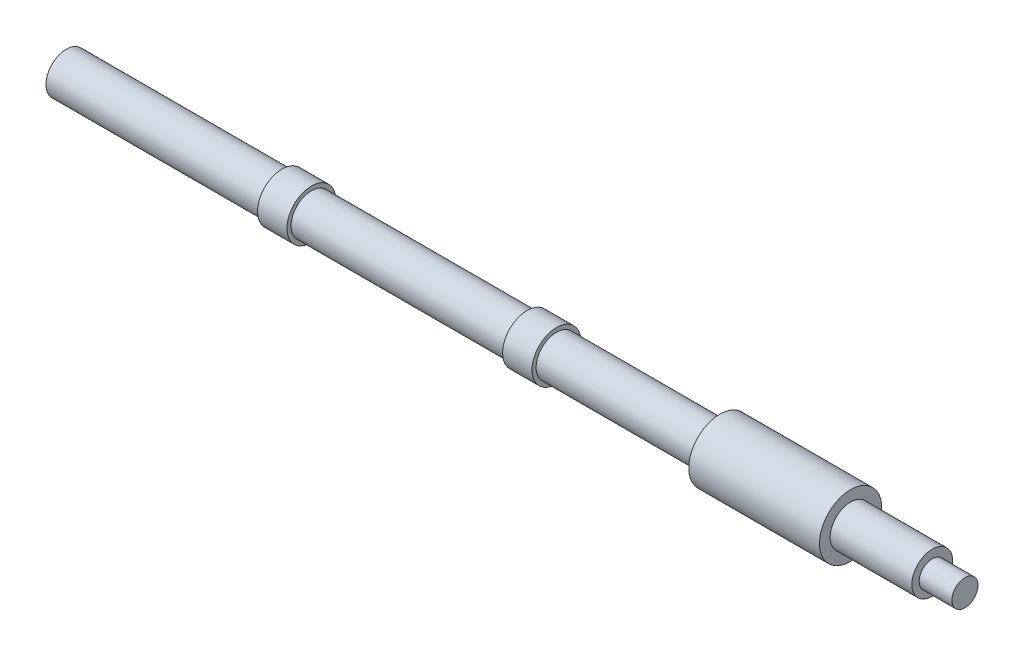
ISO-10303-21;
HEADER;
FILE_DESCRIPTION(('STEP AP214'),'2;1');
FILE_NAME('part.step','',(''),(''),'','','');
FILE_SCHEMA(('AUTOMOTIVE_DESIGN { 1 0 10303 214 1 1 1 1 }'));
ENDSEC;
DATA;
#1=APPLICATION_CONTEXT('core data for automotive mechanical design processes');
#2=APPLICATION_PROTOCOL_DEFINITION('international standard','automotive_design',2000,#1);
#3=PRODUCT_CONTEXT('',#1,'mechanical');
#4=PRODUCT('Part','Part','',(#3));
#5=PRODUCT_RELATED_PRODUCT_CATEGORY('part','',(#4));
#6=PRODUCT_DEFINITION_FORMATION('','',#4);
#7=PRODUCT_DEFINITION_CONTEXT('part definition',#1,'design');
#8=PRODUCT_DEFINITION('design','',#6,#7);
#9=PRODUCT_DEFINITION_SHAPE('','',#8);
#10=(LENGTH_UNIT() NAMED_UNIT(*) SI_UNIT(.MILLI.,.METRE.));
#11=(NAMED_UNIT(*) PLANE_ANGLE_UNIT() SI_UNIT($,.RADIAN.));
#12=(NAMED_UNIT(*) SI_UNIT($,.STERADIAN.) SOLID_ANGLE_UNIT());
#13=UNCERTAINTY_MEASURE_WITH_UNIT(LENGTH_MEASURE(1.E-05),#10,'distance_accuracy_value','');
#14=(GEOMETRIC_REPRESENTATION_CONTEXT(3) GLOBAL_UNCERTAINTY_ASSIGNED_CONTEXT((#13)) GLOBAL_UNIT_ASSIGNED_CONTEXT((#10,
#11,#12)) REPRESENTATION_CONTEXT('',''));
#15=CARTESIAN_POINT('',(0.,0.,0.));
#16=DIRECTION('',(0.,0.,1.));
#17=DIRECTION('',(1.,0.,0.));
#18=AXIS2_PLACEMENT_3D('',#15,#16,#17);
#19=CARTESIAN_POINT('',(-50.,0.,0.));
#20=DIRECTION('',(1.,0.,0.));
#21=DIRECTION('',(0.,0.,-1.));
#22=AXIS2_PLACEMENT_3D('',#19,#20,#21);
#23=CYLINDRICAL_SURFACE('',#22,12.5);
#24=CARTESIAN_POINT('',(-50.,0.,0.));
#25=DIRECTION('',(1.,0.,0.));
#26=DIRECTION('',(0.,0.,-1.));
#27=AXIS2_PLACEMENT_3D('',#24,#25,#26);
#28=CIRCLE('',#27,12.5);
#29=CARTESIAN_POINT('',(-50.,0.,-12.5));
#30=VERTEX_POINT('',#29);
#31=EDGE_CURVE('E92',#30,#30,#28,.T.);
#32=ORIENTED_EDGE('',*,*,#31,.T.);
#33=EDGE_LOOP('',(#32));
#34=FACE_BOUND('',#33,.T.);
#35=CARTESIAN_POINT('',(82.,0.,0.));
#36=DIRECTION('',(1.,0.,0.));
#37=DIRECTION('',(0.,0.,-1.));
#38=AXIS2_PLACEMENT_3D('',#35,#36,#37);
#39=CIRCLE('',#38,12.5);
#40=CARTESIAN_POINT('',(82.,0.,-12.5));
#41=VERTEX_POINT('',#40);
#42=EDGE_CURVE('E40',#41,#41,#39,.F.);
#43=ORIENTED_EDGE('',*,*,#42,.T.);
#44=EDGE_LOOP('',(#43));
#45=FACE_BOUND('',#44,.T.);
#46=ADVANCED_FACE('F37',(#34,#45),#23,.T.);
#47=CARTESIAN_POINT('',(-50.,0.,0.));
#48=DIRECTION('',(1.,0.,0.));
#49=DIRECTION('',(0.,0.,-1.));
#50=AXIS2_PLACEMENT_3D('',#47,#48,#49);
#51=PLANE('',#50);
#52=ORIENTED_EDGE('',*,*,#31,.F.);
#53=EDGE_LOOP('',(#52));
#54=FACE_BOUND('',#53,.T.);
#55=ADVANCED_FACE('F118',(#54),#51,.F.);
#56=CARTESIAN_POINT('',(82.,0.,0.));
#57=DIRECTION('',(1.,0.,0.));
#58=DIRECTION('',(0.,0.,-1.));
#59=AXIS2_PLACEMENT_3D('',#56,#57,#58);
#60=CYLINDRICAL_SURFACE('',#59,15.);
#61=CARTESIAN_POINT('',(82.,0.,0.));
#62=DIRECTION('',(1.,0.,0.));
#63=DIRECTION('',(0.,0.,-1.));
#64=AXIS2_PLACEMENT_3D('',#61,#62,#63);
#65=CIRCLE('',#64,15.);
#66=CARTESIAN_POINT('',(82.,0.,-15.));
#67=VERTEX_POINT('',#66);
#68=EDGE_CURVE('E93',#67,#67,#65,.T.);
#69=ORIENTED_EDGE('',*,*,#68,.T.);
#70=EDGE_LOOP('',(#69));
#71=FACE_BOUND('',#70,.T.);
#72=CARTESIAN_POINT('',(100.,0.,0.));
#73=DIRECTION('',(1.,0.,0.));
#74=DIRECTION('',(0.,0.,-1.));
#75=AXIS2_PLACEMENT_3D('',#72,#73,#74);
#76=CIRCLE('',#75,15.);
#77=CARTESIAN_POINT('',(100.,0.,-15.));
#78=VERTEX_POINT('',#77);
#79=EDGE_CURVE('E88',#78,#78,#76,.T.);
#80=ORIENTED_EDGE('',*,*,#79,.F.);
#81=EDGE_LOOP('',(#80));
#82=FACE_BOUND('',#81,.T.);
#83=ADVANCED_FACE('F112',(#71,#82),#60,.T.);
#84=CARTESIAN_POINT('',(82.,0.,0.));
#85=DIRECTION('',(1.,0.,0.));
#86=DIRECTION('',(0.,0.,-1.));
#87=AXIS2_PLACEMENT_3D('',#84,#85,#86);
#88=PLANE('',#87);
#89=ORIENTED_EDGE('',*,*,#42,.F.);
#90=EDGE_LOOP('',(#89));
#91=FACE_BOUND('',#90,.T.);
#92=ORIENTED_EDGE('',*,*,#68,.F.);
#93=EDGE_LOOP('',(#92));
#94=FACE_BOUND('',#93,.T.);
#95=ADVANCED_FACE('F108',(#91,#94),#88,.F.);
#96=CARTESIAN_POINT('',(100.,0.,0.));
#97=DIRECTION('',(1.,0.,0.));
#98=DIRECTION('',(0.,0.,-1.));
#99=AXIS2_PLACEMENT_3D('',#96,#97,#98);
#100=PLANE('',#99);
#101=CARTESIAN_POINT('',(100.,0.,0.));
#102=DIRECTION('',(1.,0.,0.));
#103=DIRECTION('',(0.,0.,-1.));
#104=AXIS2_PLACEMENT_3D('',#101,#102,#103);
#105=CIRCLE('',#104,12.5);
#106=CARTESIAN_POINT('',(100.,0.,-12.5));
#107=VERTEX_POINT('',#106);
#108=EDGE_CURVE('E76',#107,#107,#105,.T.);
#109=ORIENTED_EDGE('',*,*,#108,.F.);
#110=EDGE_LOOP('',(#109));
#111=FACE_BOUND('',#110,.T.);
#112=ORIENTED_EDGE('',*,*,#79,.T.);
#113=EDGE_LOOP('',(#112));
#114=FACE_BOUND('',#113,.T.);
#115=ADVANCED_FACE('F111',(#111,#114),#100,.T.);
#116=CARTESIAN_POINT('',(232.,0.,0.));
#117=DIRECTION('',(-1.,0.,0.));
#118=DIRECTION('',(0.,0.,1.));
#119=AXIS2_PLACEMENT_3D('',#116,#117,#118);
#120=CYLINDRICAL_SURFACE('',#119,12.5);
#121=CARTESIAN_POINT('',(232.,0.,0.));
#122=DIRECTION('',(1.,0.,0.));
#123=DIRECTION('',(0.,0.,-1.));
#124=AXIS2_PLACEMENT_3D('',#121,#122,#123);
#125=CIRCLE('',#124,12.5);
#126=CARTESIAN_POINT('',(232.,0.,-12.5));
#127=VERTEX_POINT('',#126);
#128=EDGE_CURVE('E81',#127,#127,#125,.T.);
#129=ORIENTED_EDGE('',*,*,#128,.F.);
#130=EDGE_LOOP('',(#129));
#131=FACE_BOUND('',#130,.T.);
#132=ORIENTED_EDGE('',*,*,#108,.T.);
#133=EDGE_LOOP('',(#132));
#134=FACE_BOUND('',#133,.T.);
#135=ADVANCED_FACE('F123',(#131,#134),#120,.T.);
#136=CARTESIAN_POINT('',(250.,0.,0.));
#137=DIRECTION('',(-1.,0.,0.));
#138=DIRECTION('',(0.,0.,1.));
#139=AXIS2_PLACEMENT_3D('',#136,#137,#138);
#140=CYLINDRICAL_SURFACE('',#139,15.);
#141=CARTESIAN_POINT('',(250.,0.,0.));
#142=DIRECTION('',(1.,0.,0.));
#143=DIRECTION('',(0.,0.,-1.));
#144=AXIS2_PLACEMENT_3D('',#141,#142,#143);
#145=CIRCLE('',#144,15.);
#146=CARTESIAN_POINT('',(250.,0.,-15.));
#147=VERTEX_POINT('',#146);
#148=EDGE_CURVE('E77',#147,#147,#145,.T.);
#149=ORIENTED_EDGE('',*,*,#148,.F.);
#150=EDGE_LOOP('',(#149));
#151=FACE_BOUND('',#150,.T.);
#152=CARTESIAN_POINT('',(232.,0.,0.));
#153=DIRECTION('',(1.,0.,0.));
#154=DIRECTION('',(0.,0.,-1.));
#155=AXIS2_PLACEMENT_3D('',#152,#153,#154);
#156=CIRCLE('',#155,15.);
#157=CARTESIAN_POINT('',(232.,0.,-15.));
#158=VERTEX_POINT('',#157);
#159=EDGE_CURVE('E72',#158,#158,#156,.T.);
#160=ORIENTED_EDGE('',*,*,#159,.T.);
#161=EDGE_LOOP('',(#160));
#162=FACE_BOUND('',#161,.T.);
#163=ADVANCED_FACE('F129',(#151,#162),#140,.T.);
#164=CARTESIAN_POINT('',(250.,0.,0.));
#165=DIRECTION('',(1.,0.,0.));
#166=DIRECTION('',(0.,0.,-1.));
#167=AXIS2_PLACEMENT_3D('',#164,#165,#166);
#168=PLANE('',#167);
#169=CARTESIAN_POINT('',(250.,0.,0.));
#170=DIRECTION('',(1.,0.,0.));
#171=DIRECTION('',(0.,0.,-1.));
#172=AXIS2_PLACEMENT_3D('',#169,#170,#171);
#173=CIRCLE('',#172,12.5);
#174=CARTESIAN_POINT('',(250.,0.,-12.5));
#175=VERTEX_POINT('',#174);
#176=EDGE_CURVE('E51',#175,#175,#173,.T.);
#177=ORIENTED_EDGE('',*,*,#176,.F.);
#178=EDGE_LOOP('',(#177));
#179=FACE_BOUND('',#178,.T.);
#180=ORIENTED_EDGE('',*,*,#148,.T.);
#181=EDGE_LOOP('',(#180));
#182=FACE_BOUND('',#181,.T.);
#183=ADVANCED_FACE('F168',(#179,#182),#168,.T.);
#184=CARTESIAN_POINT('',(232.,0.,0.));
#185=DIRECTION('',(1.,0.,0.));
#186=DIRECTION('',(0.,0.,-1.));
#187=AXIS2_PLACEMENT_3D('',#184,#185,#186);
#188=PLANE('',#187);
#189=ORIENTED_EDGE('',*,*,#128,.T.);
#190=EDGE_LOOP('',(#189));
#191=FACE_BOUND('',#190,.T.);
#192=ORIENTED_EDGE('',*,*,#159,.F.);
#193=EDGE_LOOP('',(#192));
#194=FACE_BOUND('',#193,.T.);
#195=ADVANCED_FACE('F176',(#191,#194),#188,.F.);
#196=CARTESIAN_POINT('',(350.,0.,0.));
#197=DIRECTION('',(-1.,0.,0.));
#198=DIRECTION('',(0.,0.,1.));
#199=AXIS2_PLACEMENT_3D('',#196,#197,#198);
#200=CYLINDRICAL_SURFACE('',#199,12.5);
#201=CARTESIAN_POINT('',(350.,0.,0.));
#202=DIRECTION('',(1.,0.,0.));
#203=DIRECTION('',(0.,0.,-1.));
#204=AXIS2_PLACEMENT_3D('',#201,#202,#203);
#205=CIRCLE('',#204,12.5);
#206=CARTESIAN_POINT('',(350.,0.,-12.5));
#207=VERTEX_POINT('',#206);
#208=EDGE_CURVE('E65',#207,#207,#205,.T.);
#209=ORIENTED_EDGE('',*,*,#208,.F.);
#210=EDGE_LOOP('',(#209));
#211=FACE_BOUND('',#210,.T.);
#212=ORIENTED_EDGE('',*,*,#176,.T.);
#213=EDGE_LOOP('',(#212));
#214=FACE_BOUND('',#213,.T.);
#215=ADVANCED_FACE('F181',(#211,#214),#200,.T.);
#216=CARTESIAN_POINT('',(430.,0.,0.));
#217=DIRECTION('',(-1.,0.,0.));
#218=DIRECTION('',(0.,0.,1.));
#219=AXIS2_PLACEMENT_3D('',#216,#217,#218);
#220=CYLINDRICAL_SURFACE('',#219,19.05);
#221=CARTESIAN_POINT('',(430.,0.,0.));
#222=DIRECTION('',(1.,0.,0.));
#223=DIRECTION('',(0.,0.,-1.));
#224=AXIS2_PLACEMENT_3D('',#221,#222,#223);
#225=CIRCLE('',#224,19.05);
#226=CARTESIAN_POINT('',(430.,0.,-19.05));
#227=VERTEX_POINT('',#226);
#228=EDGE_CURVE('E61',#227,#227,#225,.T.);
#229=ORIENTED_EDGE('',*,*,#228,.F.);
#230=EDGE_LOOP('',(#229));
#231=FACE_BOUND('',#230,.T.);
#232=CARTESIAN_POINT('',(350.,0.,0.));
#233=DIRECTION('',(1.,0.,0.));
#234=DIRECTION('',(0.,0.,-1.));
#235=AXIS2_PLACEMENT_3D('',#232,#233,#234);
#236=CIRCLE('',#235,19.05);
#237=CARTESIAN_POINT('',(350.,0.,-19.05));
#238=VERTEX_POINT('',#237);
#239=EDGE_CURVE('E59',#238,#238,#236,.T.);
#240=ORIENTED_EDGE('',*,*,#239,.T.);
#241=EDGE_LOOP('',(#240));
#242=FACE_BOUND('',#241,.T.);
#243=ADVANCED_FACE('F198',(#231,#242),#220,.T.);
#244=CARTESIAN_POINT('',(430.,0.,0.));
#245=DIRECTION('',(1.,0.,0.));
#246=DIRECTION('',(0.,0.,-1.));
#247=AXIS2_PLACEMENT_3D('',#244,#245,#246);
#248=PLANE('',#247);
#249=CARTESIAN_POINT('',(430.,0.,0.));
#250=DIRECTION('',(1.,0.,0.));
#251=DIRECTION('',(0.,0.,-1.));
#252=AXIS2_PLACEMENT_3D('',#249,#250,#251);
#253=CIRCLE('',#252,12.5);
#254=CARTESIAN_POINT('',(430.,0.,-12.5));
#255=VERTEX_POINT('',#254);
#256=EDGE_CURVE('E45',#255,#255,#253,.T.);
#257=ORIENTED_EDGE('',*,*,#256,.F.);
#258=EDGE_LOOP('',(#257));
#259=FACE_BOUND('',#258,.T.);
#260=ORIENTED_EDGE('',*,*,#228,.T.);
#261=EDGE_LOOP('',(#260));
#262=FACE_BOUND('',#261,.T.);
#263=ADVANCED_FACE('F208',(#259,#262),#248,.T.);
#264=CARTESIAN_POINT('',(350.,0.,0.));
#265=DIRECTION('',(1.,0.,0.));
#266=DIRECTION('',(0.,0.,-1.));
#267=AXIS2_PLACEMENT_3D('',#264,#265,#266);
#268=PLANE('',#267);
#269=ORIENTED_EDGE('',*,*,#208,.T.);
#270=EDGE_LOOP('',(#269));
#271=FACE_BOUND('',#270,.T.);
#272=ORIENTED_EDGE('',*,*,#239,.F.);
#273=EDGE_LOOP('',(#272));
#274=FACE_BOUND('',#273,.T.);
#275=ADVANCED_FACE('F216',(#271,#274),#268,.F.);
#276=CARTESIAN_POINT('',(480.,0.,0.));
#277=DIRECTION('',(-1.,0.,0.));
#278=DIRECTION('',(0.,0.,1.));
#279=AXIS2_PLACEMENT_3D('',#276,#277,#278);
#280=CYLINDRICAL_SURFACE('',#279,12.5);
#281=CARTESIAN_POINT('',(480.,0.,0.));
#282=DIRECTION('',(1.,0.,0.));
#283=DIRECTION('',(0.,0.,-1.));
#284=AXIS2_PLACEMENT_3D('',#281,#282,#283);
#285=CIRCLE('',#284,12.5);
#286=CARTESIAN_POINT('',(480.,0.,-12.5));
#287=VERTEX_POINT('',#286);
#288=EDGE_CURVE('E56',#287,#287,#285,.T.);
#289=ORIENTED_EDGE('',*,*,#288,.F.);
#290=EDGE_LOOP('',(#289));
#291=FACE_BOUND('',#290,.T.);
#292=ORIENTED_EDGE('',*,*,#256,.T.);
#293=EDGE_LOOP('',(#292));
#294=FACE_BOUND('',#293,.T.);
#295=ADVANCED_FACE('F221',(#291,#294),#280,.T.);
#296=CARTESIAN_POINT('',(480.,0.,0.));
#297=DIRECTION('',(1.,0.,0.));
#298=DIRECTION('',(0.,0.,-1.));
#299=AXIS2_PLACEMENT_3D('',#296,#297,#298);
#300=PLANE('',#299);
#301=CARTESIAN_POINT('',(480.,-0.605655569631387,0.));
#302=DIRECTION('',(1.,0.,0.));
#303=DIRECTION('',(0.,0.,-1.));
#304=AXIS2_PLACEMENT_3D('',#301,#302,#303);
#305=CIRCLE('',#304,8.);
#306=CARTESIAN_POINT('',(480.,-0.605655569631387,-8.));
#307=VERTEX_POINT('',#306);
#308=EDGE_CURVE('E10',#307,#307,#305,.T.);
#309=ORIENTED_EDGE('',*,*,#308,.F.);
#310=EDGE_LOOP('',(#309));
#311=FACE_BOUND('',#310,.T.);
#312=ORIENTED_EDGE('',*,*,#288,.T.);
#313=EDGE_LOOP('',(#312));
#314=FACE_BOUND('',#313,.T.);
#315=ADVANCED_FACE('F238',(#311,#314),#300,.T.);
#316=CARTESIAN_POINT('',(500.,-0.605655569631387,0.));
#317=DIRECTION('',(-1.,0.,0.));
#318=DIRECTION('',(0.,0.,1.));
#319=AXIS2_PLACEMENT_3D('',#316,#317,#318);
#320=CYLINDRICAL_SURFACE('',#319,8.);
#321=CARTESIAN_POINT('',(500.,-0.605655569631387,0.));
#322=DIRECTION('',(1.,0.,0.));
#323=DIRECTION('',(0.,0.,-1.));
#324=AXIS2_PLACEMENT_3D('',#321,#322,#323);
#325=CIRCLE('',#324,8.);
#326=CARTESIAN_POINT('',(500.,-0.605655569631387,-8.));
#327=VERTEX_POINT('',#326);
#328=EDGE_CURVE('E55',#327,#327,#325,.T.);
#329=ORIENTED_EDGE('',*,*,#328,.F.);
#330=EDGE_LOOP('',(#329));
#331=FACE_BOUND('',#330,.T.);
#332=ORIENTED_EDGE('',*,*,#308,.T.);
#333=EDGE_LOOP('',(#332));
#334=FACE_BOUND('',#333,.T.);
#335=ADVANCED_FACE('F248',(#331,#334),#320,.T.);
#336=CARTESIAN_POINT('',(500.,-0.605655569631387,0.));
#337=DIRECTION('',(1.,0.,0.));
#338=DIRECTION('',(0.,0.,-1.));
#339=AXIS2_PLACEMENT_3D('',#336,#337,#338);
#340=PLANE('',#339);
#341=ORIENTED_EDGE('',*,*,#328,.T.);
#342=EDGE_LOOP('',(#341));
#343=FACE_BOUND('',#342,.T.);
#344=ADVANCED_FACE('F258',(#343),#340,.T.);
#345=CLOSED_SHELL('',(#46,#55,#83,#95,#115,#135,#163,#183,#195,#215,#243,#263,#275,#295,#315,
#335,#344));
#346=MANIFOLD_SOLID_BREP('B2',#345);
#347=ADVANCED_BREP_SHAPE_REPRESENTATION('',(#18,#346),#14);
#348=SHAPE_DEFINITION_REPRESENTATION(#9,#347);
ENDSEC;
END-ISO-10303-21;
